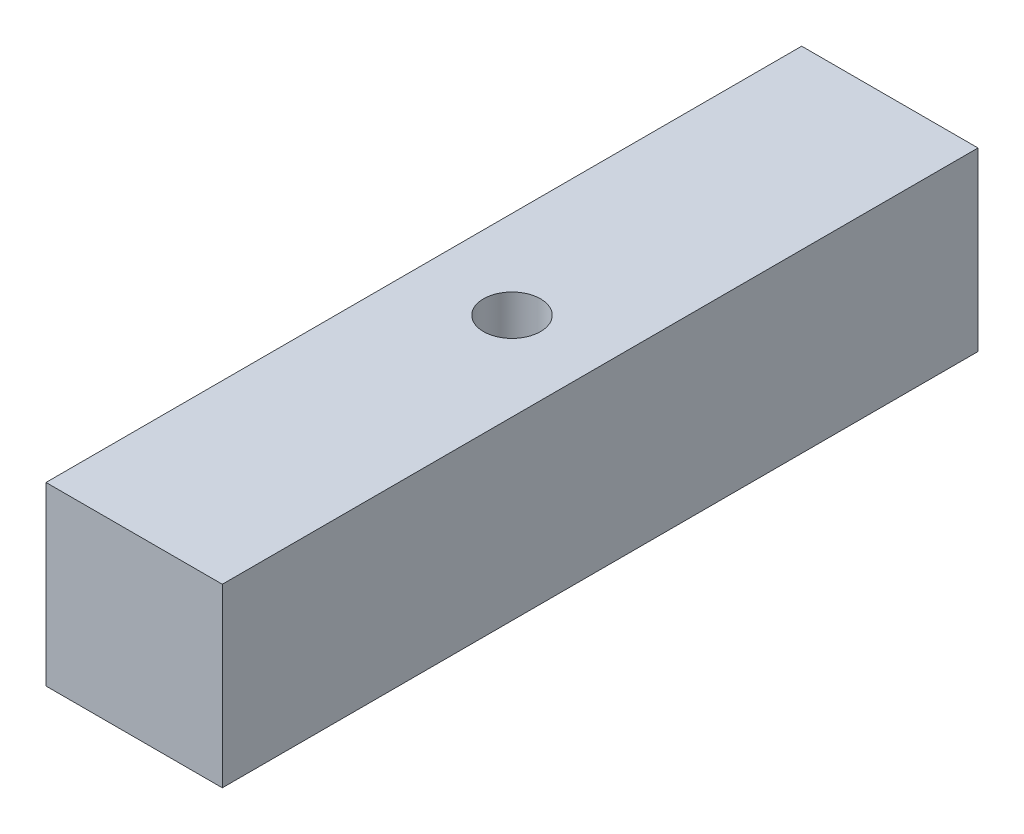
ISO-10303-21;
HEADER;
FILE_DESCRIPTION(('STEP AP214'),'2;1');
FILE_NAME('part.step','',(''),(''),'','','');
FILE_SCHEMA(('AUTOMOTIVE_DESIGN { 1 0 10303 214 1 1 1 1 }'));
ENDSEC;
DATA;
#1=APPLICATION_CONTEXT('core data for automotive mechanical design processes');
#2=APPLICATION_PROTOCOL_DEFINITION('international standard','automotive_design',2000,#1);
#3=PRODUCT_CONTEXT('',#1,'mechanical');
#4=PRODUCT('Part','Part','',(#3));
#5=PRODUCT_RELATED_PRODUCT_CATEGORY('part','',(#4));
#6=PRODUCT_DEFINITION_FORMATION('','',#4);
#7=PRODUCT_DEFINITION_CONTEXT('part definition',#1,'design');
#8=PRODUCT_DEFINITION('design','',#6,#7);
#9=PRODUCT_DEFINITION_SHAPE('','',#8);
#10=(LENGTH_UNIT() NAMED_UNIT(*) SI_UNIT(.MILLI.,.METRE.));
#11=(NAMED_UNIT(*) PLANE_ANGLE_UNIT() SI_UNIT($,.RADIAN.));
#12=(NAMED_UNIT(*) SI_UNIT($,.STERADIAN.) SOLID_ANGLE_UNIT());
#13=UNCERTAINTY_MEASURE_WITH_UNIT(LENGTH_MEASURE(1.E-05),#10,'distance_accuracy_value','');
#14=(GEOMETRIC_REPRESENTATION_CONTEXT(3) GLOBAL_UNCERTAINTY_ASSIGNED_CONTEXT((#13)) GLOBAL_UNIT_ASSIGNED_CONTEXT((#10,
#11,#12)) REPRESENTATION_CONTEXT('',''));
#15=CARTESIAN_POINT('',(0.,0.,0.));
#16=DIRECTION('',(0.,0.,1.));
#17=DIRECTION('',(1.,0.,0.));
#18=AXIS2_PLACEMENT_3D('',#15,#16,#17);
#19=CARTESIAN_POINT('',(0.,0.,30.));
#20=DIRECTION('',(1.,0.,0.));
#21=DIRECTION('',(0.,0.,-1.));
#22=AXIS2_PLACEMENT_3D('',#19,#20,#21);
#23=PLANE('',#22);
#24=DIRECTION('',(0.,-1.,0.));
#25=VECTOR('',#24,1.);
#26=CARTESIAN_POINT('',(0.,0.,0.));
#27=LINE('',#26,#25);
#28=CARTESIAN_POINT('',(0.,7.,0.));
#29=VERTEX_POINT('',#28);
#30=CARTESIAN_POINT('',(0.,0.,0.));
#31=VERTEX_POINT('',#30);
#32=EDGE_CURVE('E97',#29,#31,#27,.T.);
#33=ORIENTED_EDGE('',*,*,#32,.T.);
#34=DIRECTION('',(0.,0.,-1.));
#35=VECTOR('',#34,1.);
#36=CARTESIAN_POINT('',(0.,0.,30.));
#37=LINE('',#36,#35);
#38=CARTESIAN_POINT('',(0.,0.,30.));
#39=VERTEX_POINT('',#38);
#40=EDGE_CURVE('E11',#39,#31,#37,.T.);
#41=ORIENTED_EDGE('',*,*,#40,.F.);
#42=DIRECTION('',(0.,-1.,0.));
#43=VECTOR('',#42,1.);
#44=CARTESIAN_POINT('',(0.,0.,30.));
#45=LINE('',#44,#43);
#46=CARTESIAN_POINT('',(0.,7.,30.));
#47=VERTEX_POINT('',#46);
#48=EDGE_CURVE('E85',#47,#39,#45,.T.);
#49=ORIENTED_EDGE('',*,*,#48,.F.);
#50=DIRECTION('',(0.,0.,-1.));
#51=VECTOR('',#50,1.);
#52=CARTESIAN_POINT('',(0.,7.,30.));
#53=LINE('',#52,#51);
#54=EDGE_CURVE('E93',#47,#29,#53,.T.);
#55=ORIENTED_EDGE('',*,*,#54,.T.);
#56=EDGE_LOOP('',(#33,#41,#49,#55));
#57=FACE_BOUND('',#56,.T.);
#58=ADVANCED_FACE('F34',(#57),#23,.F.);
#59=CARTESIAN_POINT('',(0.,0.,30.));
#60=DIRECTION('',(0.,1.,0.));
#61=DIRECTION('',(0.,0.,1.));
#62=AXIS2_PLACEMENT_3D('',#59,#60,#61);
#63=PLANE('',#62);
#64=CARTESIAN_POINT('',(3.5,0.,15.));
#65=DIRECTION('',(0.,1.,0.));
#66=DIRECTION('',(-1.,0.,0.));
#67=AXIS2_PLACEMENT_3D('',#64,#65,#66);
#68=CIRCLE('',#67,1.1303);
#69=CARTESIAN_POINT('',(2.3697,0.,15.));
#70=VERTEX_POINT('',#69);
#71=EDGE_CURVE('E100',#70,#70,#68,.T.);
#72=ORIENTED_EDGE('',*,*,#71,.T.);
#73=EDGE_LOOP('',(#72));
#74=FACE_BOUND('',#73,.T.);
#75=DIRECTION('',(1.,0.,0.));
#76=VECTOR('',#75,1.);
#77=CARTESIAN_POINT('',(0.,0.,0.));
#78=LINE('',#77,#76);
#79=CARTESIAN_POINT('',(7.,0.,0.));
#80=VERTEX_POINT('',#79);
#81=EDGE_CURVE('E89',#31,#80,#78,.T.);
#82=ORIENTED_EDGE('',*,*,#81,.T.);
#83=DIRECTION('',(0.,0.,-1.));
#84=VECTOR('',#83,1.);
#85=CARTESIAN_POINT('',(7.,0.,30.));
#86=LINE('',#85,#84);
#87=CARTESIAN_POINT('',(7.,0.,30.));
#88=VERTEX_POINT('',#87);
#89=EDGE_CURVE('E42',#88,#80,#86,.T.);
#90=ORIENTED_EDGE('',*,*,#89,.F.);
#91=DIRECTION('',(1.,0.,0.));
#92=VECTOR('',#91,1.);
#93=CARTESIAN_POINT('',(0.,0.,30.));
#94=LINE('',#93,#92);
#95=EDGE_CURVE('E80',#39,#88,#94,.T.);
#96=ORIENTED_EDGE('',*,*,#95,.F.);
#97=ORIENTED_EDGE('',*,*,#40,.T.);
#98=EDGE_LOOP('',(#82,#90,#96,#97));
#99=FACE_BOUND('',#98,.T.);
#100=ADVANCED_FACE('F88',(#74,#99),#63,.F.);
#101=CARTESIAN_POINT('',(7.,0.,30.));
#102=DIRECTION('',(-1.,0.,0.));
#103=DIRECTION('',(0.,0.,1.));
#104=AXIS2_PLACEMENT_3D('',#101,#102,#103);
#105=PLANE('',#104);
#106=DIRECTION('',(0.,1.,0.));
#107=VECTOR('',#106,1.);
#108=CARTESIAN_POINT('',(7.,0.,0.));
#109=LINE('',#108,#107);
#110=CARTESIAN_POINT('',(7.,7.,0.));
#111=VERTEX_POINT('',#110);
#112=EDGE_CURVE('E67',#80,#111,#109,.T.);
#113=ORIENTED_EDGE('',*,*,#112,.T.);
#114=DIRECTION('',(0.,0.,-1.));
#115=VECTOR('',#114,1.);
#116=CARTESIAN_POINT('',(7.,7.,30.));
#117=LINE('',#116,#115);
#118=CARTESIAN_POINT('',(7.,7.,30.));
#119=VERTEX_POINT('',#118);
#120=EDGE_CURVE('E90',#119,#111,#117,.T.);
#121=ORIENTED_EDGE('',*,*,#120,.F.);
#122=DIRECTION('',(0.,1.,0.));
#123=VECTOR('',#122,1.);
#124=CARTESIAN_POINT('',(7.,0.,30.));
#125=LINE('',#124,#123);
#126=EDGE_CURVE('E83',#88,#119,#125,.T.);
#127=ORIENTED_EDGE('',*,*,#126,.F.);
#128=ORIENTED_EDGE('',*,*,#89,.T.);
#129=EDGE_LOOP('',(#113,#121,#127,#128));
#130=FACE_BOUND('',#129,.T.);
#131=ADVANCED_FACE('F91',(#130),#105,.F.);
#132=CARTESIAN_POINT('',(0.,7.,30.));
#133=DIRECTION('',(0.,-1.,0.));
#134=DIRECTION('',(1.,0.,0.));
#135=AXIS2_PLACEMENT_3D('',#132,#133,#134);
#136=PLANE('',#135);
#137=CARTESIAN_POINT('',(3.5,7.,15.));
#138=DIRECTION('',(0.,1.,0.));
#139=DIRECTION('',(-1.,0.,0.));
#140=AXIS2_PLACEMENT_3D('',#137,#138,#139);
#141=CIRCLE('',#140,1.1303);
#142=CARTESIAN_POINT('',(2.3697,7.,15.));
#143=VERTEX_POINT('',#142);
#144=EDGE_CURVE('E111',#143,#143,#141,.T.);
#145=ORIENTED_EDGE('',*,*,#144,.F.);
#146=EDGE_LOOP('',(#145));
#147=FACE_BOUND('',#146,.T.);
#148=DIRECTION('',(-1.,0.,0.));
#149=VECTOR('',#148,1.);
#150=CARTESIAN_POINT('',(0.,7.,0.));
#151=LINE('',#150,#149);
#152=EDGE_CURVE('E73',#111,#29,#151,.T.);
#153=ORIENTED_EDGE('',*,*,#152,.T.);
#154=ORIENTED_EDGE('',*,*,#54,.F.);
#155=DIRECTION('',(-1.,0.,0.));
#156=VECTOR('',#155,1.);
#157=CARTESIAN_POINT('',(0.,7.,30.));
#158=LINE('',#157,#156);
#159=EDGE_CURVE('E50',#119,#47,#158,.T.);
#160=ORIENTED_EDGE('',*,*,#159,.F.);
#161=ORIENTED_EDGE('',*,*,#120,.T.);
#162=EDGE_LOOP('',(#153,#154,#160,#161));
#163=FACE_BOUND('',#162,.T.);
#164=ADVANCED_FACE('F105',(#147,#163),#136,.F.);
#165=CARTESIAN_POINT('',(0.,0.,30.));
#166=DIRECTION('',(0.,0.,-1.));
#167=DIRECTION('',(-1.,0.,0.));
#168=AXIS2_PLACEMENT_3D('',#165,#166,#167);
#169=PLANE('',#168);
#170=ORIENTED_EDGE('',*,*,#48,.T.);
#171=ORIENTED_EDGE('',*,*,#95,.T.);
#172=ORIENTED_EDGE('',*,*,#126,.T.);
#173=ORIENTED_EDGE('',*,*,#159,.T.);
#174=EDGE_LOOP('',(#170,#171,#172,#173));
#175=FACE_BOUND('',#174,.T.);
#176=ADVANCED_FACE('F81',(#175),#169,.F.);
#177=CARTESIAN_POINT('',(0.,0.,0.));
#178=DIRECTION('',(0.,0.,-1.));
#179=DIRECTION('',(-1.,0.,0.));
#180=AXIS2_PLACEMENT_3D('',#177,#178,#179);
#181=PLANE('',#180);
#182=ORIENTED_EDGE('',*,*,#32,.F.);
#183=ORIENTED_EDGE('',*,*,#152,.F.);
#184=ORIENTED_EDGE('',*,*,#112,.F.);
#185=ORIENTED_EDGE('',*,*,#81,.F.);
#186=EDGE_LOOP('',(#182,#183,#184,#185));
#187=FACE_BOUND('',#186,.T.);
#188=ADVANCED_FACE('F108',(#187),#181,.T.);
#189=CARTESIAN_POINT('',(3.5,0.,15.));
#190=DIRECTION('',(0.,1.,0.));
#191=DIRECTION('',(-1.,0.,0.));
#192=AXIS2_PLACEMENT_3D('',#189,#190,#191);
#193=CYLINDRICAL_SURFACE('',#192,1.1303);
#194=ORIENTED_EDGE('',*,*,#71,.F.);
#195=EDGE_LOOP('',(#194));
#196=FACE_BOUND('',#195,.T.);
#197=ORIENTED_EDGE('',*,*,#144,.T.);
#198=EDGE_LOOP('',(#197));
#199=FACE_BOUND('',#198,.T.);
#200=ADVANCED_FACE('F118',(#196,#199),#193,.F.);
#201=CLOSED_SHELL('',(#58,#100,#131,#164,#176,#188,#200));
#202=MANIFOLD_SOLID_BREP('B2',#201);
#203=ADVANCED_BREP_SHAPE_REPRESENTATION('',(#18,#202),#14);
#204=SHAPE_DEFINITION_REPRESENTATION(#9,#203);
ENDSEC;
END-ISO-10303-21;
